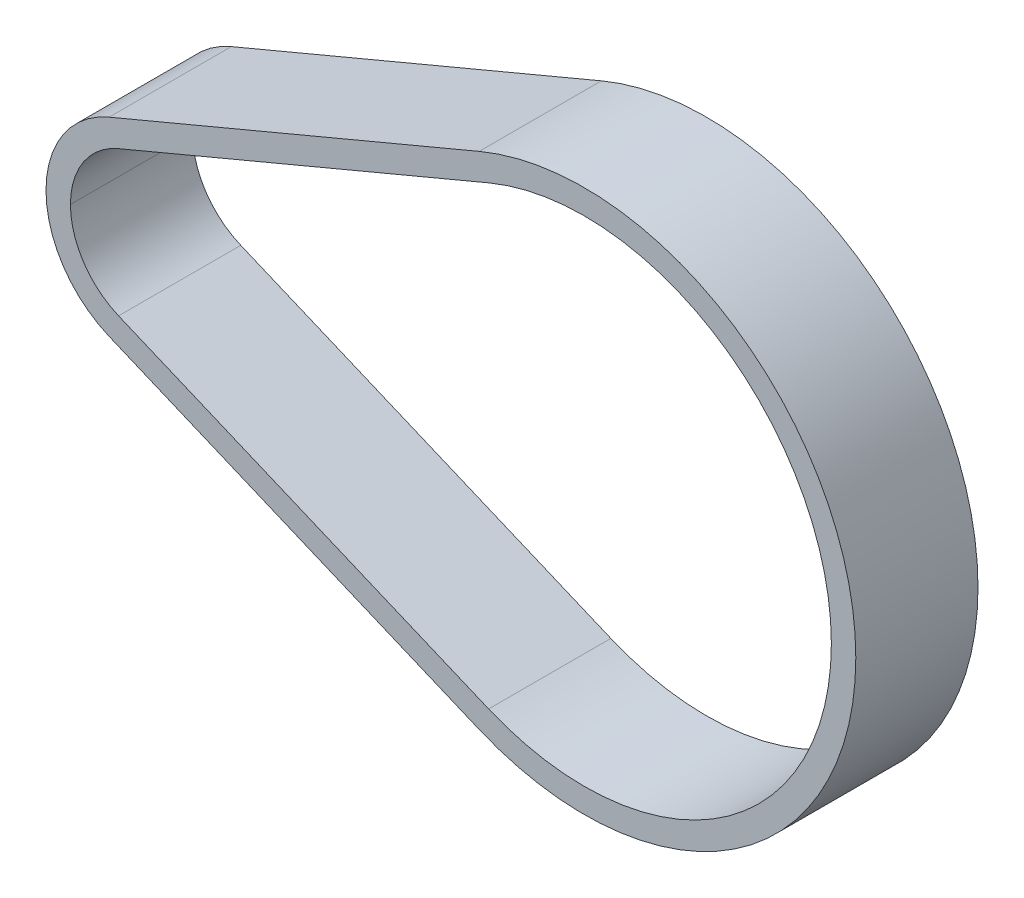
ISO-10303-21;
HEADER;
FILE_DESCRIPTION(('STEP AP214'),'2;1');
FILE_NAME('part.step','',(''),(''),'','','');
FILE_SCHEMA(('AUTOMOTIVE_DESIGN { 1 0 10303 214 1 1 1 1 }'));
ENDSEC;
DATA;
#1=APPLICATION_CONTEXT('core data for automotive mechanical design processes');
#2=APPLICATION_PROTOCOL_DEFINITION('international standard','automotive_design',2000,#1);
#3=PRODUCT_CONTEXT('',#1,'mechanical');
#4=PRODUCT('Part','Part','',(#3));
#5=PRODUCT_RELATED_PRODUCT_CATEGORY('part','',(#4));
#6=PRODUCT_DEFINITION_FORMATION('','',#4);
#7=PRODUCT_DEFINITION_CONTEXT('part definition',#1,'design');
#8=PRODUCT_DEFINITION('design','',#6,#7);
#9=PRODUCT_DEFINITION_SHAPE('','',#8);
#10=(LENGTH_UNIT() NAMED_UNIT(*) SI_UNIT(.MILLI.,.METRE.));
#11=(NAMED_UNIT(*) PLANE_ANGLE_UNIT() SI_UNIT($,.RADIAN.));
#12=(NAMED_UNIT(*) SI_UNIT($,.STERADIAN.) SOLID_ANGLE_UNIT());
#13=UNCERTAINTY_MEASURE_WITH_UNIT(LENGTH_MEASURE(1.E-05),#10,'distance_accuracy_value','');
#14=(GEOMETRIC_REPRESENTATION_CONTEXT(3) GLOBAL_UNCERTAINTY_ASSIGNED_CONTEXT((#13)) GLOBAL_UNIT_ASSIGNED_CONTEXT((#10,
#11,#12)) REPRESENTATION_CONTEXT('',''));
#15=CARTESIAN_POINT('',(0.,0.,0.));
#16=DIRECTION('',(0.,0.,1.));
#17=DIRECTION('',(1.,0.,0.));
#18=AXIS2_PLACEMENT_3D('',#15,#16,#17);
#19=CARTESIAN_POINT('',(0.,0.,15.));
#20=DIRECTION('',(0.,0.,-1.));
#21=DIRECTION('',(-1.,0.,0.));
#22=AXIS2_PLACEMENT_3D('',#19,#20,#21);
#23=CYLINDRICAL_SURFACE('',#22,9.64);
#24=CARTESIAN_POINT('',(0.,0.,15.));
#25=DIRECTION('',(0.,0.,1.));
#26=DIRECTION('',(1.,0.,0.));
#27=AXIS2_PLACEMENT_3D('',#24,#25,#26);
#28=CIRCLE('',#27,9.64);
#29=CARTESIAN_POINT('',(-3.73225299401198,8.88818809368302,15.));
#30=VERTEX_POINT('',#29);
#31=CARTESIAN_POINT('',(-9.64,0.,15.));
#32=VERTEX_POINT('',#31);
#33=EDGE_CURVE('E11',#30,#32,#28,.T.);
#34=ORIENTED_EDGE('',*,*,#33,.T.);
#35=DIRECTION('',(0.,0.,-1.));
#36=VECTOR('',#35,1.);
#37=CARTESIAN_POINT('',(-9.64,0.,15.));
#38=LINE('',#37,#36);
#39=CARTESIAN_POINT('',(-9.64,0.,0.));
#40=VERTEX_POINT('',#39);
#41=EDGE_CURVE('E27',#32,#40,#38,.T.);
#42=ORIENTED_EDGE('',*,*,#41,.T.);
#43=CARTESIAN_POINT('',(0.,0.,0.));
#44=DIRECTION('',(0.,0.,1.));
#45=DIRECTION('',(1.,0.,0.));
#46=AXIS2_PLACEMENT_3D('',#43,#44,#45);
#47=CIRCLE('',#46,9.64);
#48=CARTESIAN_POINT('',(-3.73225299401198,8.88818809368302,0.));
#49=VERTEX_POINT('',#48);
#50=EDGE_CURVE('E179',#49,#40,#47,.T.);
#51=ORIENTED_EDGE('',*,*,#50,.F.);
#52=DIRECTION('',(0.,0.,-1.));
#53=VECTOR('',#52,1.);
#54=CARTESIAN_POINT('',(-3.73225299401198,8.88818809368302,15.));
#55=LINE('',#54,#53);
#56=EDGE_CURVE('E215',#30,#49,#55,.T.);
#57=ORIENTED_EDGE('',*,*,#56,.F.);
#58=EDGE_LOOP('',(#34,#42,#51,#57));
#59=FACE_BOUND('',#58,.T.);
#60=ADVANCED_FACE('F16',(#59),#23,.F.);
#61=CARTESIAN_POINT('',(0.,0.,15.));
#62=DIRECTION('',(0.,0.,-1.));
#63=DIRECTION('',(-1.,0.,0.));
#64=AXIS2_PLACEMENT_3D('',#61,#62,#63);
#65=CYLINDRICAL_SURFACE('',#64,12.64);
#66=CARTESIAN_POINT('',(0.,0.,15.));
#67=DIRECTION('',(0.,0.,1.));
#68=DIRECTION('',(1.,0.,0.));
#69=AXIS2_PLACEMENT_3D('',#66,#67,#68);
#70=CIRCLE('',#69,12.64);
#71=CARTESIAN_POINT('',(-12.64,0.,15.));
#72=VERTEX_POINT('',#71);
#73=CARTESIAN_POINT('',(-4.89374251497006,-11.654221732796,15.));
#74=VERTEX_POINT('',#73);
#75=EDGE_CURVE('E118',#72,#74,#70,.T.);
#76=ORIENTED_EDGE('',*,*,#75,.F.);
#77=DIRECTION('',(0.,0.,-1.));
#78=VECTOR('',#77,1.);
#79=CARTESIAN_POINT('',(-12.64,0.,15.));
#80=LINE('',#79,#78);
#81=CARTESIAN_POINT('',(-12.64,0.,0.));
#82=VERTEX_POINT('',#81);
#83=EDGE_CURVE('E122',#72,#82,#80,.T.);
#84=ORIENTED_EDGE('',*,*,#83,.T.);
#85=CARTESIAN_POINT('',(0.,0.,0.));
#86=DIRECTION('',(0.,0.,1.));
#87=DIRECTION('',(1.,0.,0.));
#88=AXIS2_PLACEMENT_3D('',#85,#86,#87);
#89=CIRCLE('',#88,12.64);
#90=CARTESIAN_POINT('',(-4.89374251497006,-11.654221732796,0.));
#91=VERTEX_POINT('',#90);
#92=EDGE_CURVE('E140',#82,#91,#89,.T.);
#93=ORIENTED_EDGE('',*,*,#92,.T.);
#94=DIRECTION('',(0.,0.,-1.));
#95=VECTOR('',#94,1.);
#96=CARTESIAN_POINT('',(-4.89374251497006,-11.654221732796,15.));
#97=LINE('',#96,#95);
#98=EDGE_CURVE('E124',#74,#91,#97,.T.);
#99=ORIENTED_EDGE('',*,*,#98,.F.);
#100=EDGE_LOOP('',(#76,#84,#93,#99));
#101=FACE_BOUND('',#100,.T.);
#102=ADVANCED_FACE('F120',(#101),#65,.T.);
#103=CARTESIAN_POINT('',(0.,0.,15.));
#104=DIRECTION('',(0.,0.,1.));
#105=DIRECTION('',(1.,0.,0.));
#106=AXIS2_PLACEMENT_3D('',#103,#104,#105);
#107=PLANE('',#106);
#108=CARTESIAN_POINT('',(0.,0.,15.));
#109=DIRECTION('',(0.,0.,1.));
#110=DIRECTION('',(1.,0.,0.));
#111=AXIS2_PLACEMENT_3D('',#108,#109,#110);
#112=CIRCLE('',#111,12.64);
#113=CARTESIAN_POINT('',(-4.89374251497006,11.654221732796,15.));
#114=VERTEX_POINT('',#113);
#115=EDGE_CURVE('E130',#114,#72,#112,.T.);
#116=ORIENTED_EDGE('',*,*,#115,.T.);
#117=ORIENTED_EDGE('',*,*,#75,.T.);
#118=DIRECTION('',(0.922011213037658,-0.387163173652695,0.));
#119=VECTOR('',#118,1.);
#120=CARTESIAN_POINT('',(-4.89374251497006,-11.654221732796,15.));
#121=LINE('',#120,#119);
#122=CARTESIAN_POINT('',(40.5358514221557,-30.7306337305452,15.));
#123=VERTEX_POINT('',#122);
#124=EDGE_CURVE('E20',#74,#123,#121,.T.);
#125=ORIENTED_EDGE('',*,*,#124,.T.);
#126=CARTESIAN_POINT('',(53.44,0.,15.));
#127=DIRECTION('',(0.,0.,1.));
#128=DIRECTION('',(1.,0.,0.));
#129=AXIS2_PLACEMENT_3D('',#126,#127,#128);
#130=CIRCLE('',#129,33.33);
#131=CARTESIAN_POINT('',(40.5358514221557,30.7306337305452,15.));
#132=VERTEX_POINT('',#131);
#133=EDGE_CURVE('E216',#123,#132,#130,.T.);
#134=ORIENTED_EDGE('',*,*,#133,.T.);
#135=DIRECTION('',(-0.922011213037658,-0.387163173652695,0.));
#136=VECTOR('',#135,1.);
#137=CARTESIAN_POINT('',(-4.89374251497006,11.654221732796,15.));
#138=LINE('',#137,#136);
#139=EDGE_CURVE('E144',#132,#114,#138,.T.);
#140=ORIENTED_EDGE('',*,*,#139,.T.);
#141=EDGE_LOOP('',(#116,#117,#125,#134,#140));
#142=FACE_BOUND('',#141,.T.);
#143=DIRECTION('',(0.922011213037658,-0.387163173652695,0.));
#144=VECTOR('',#143,1.);
#145=CARTESIAN_POINT('',(-3.73225299401198,-8.88818809368302,15.));
#146=LINE('',#145,#144);
#147=CARTESIAN_POINT('',(-3.73225299401198,-8.88818809368302,15.));
#148=VERTEX_POINT('',#147);
#149=CARTESIAN_POINT('',(41.6973409431137,-27.9646000914321,15.));
#150=VERTEX_POINT('',#149);
#151=EDGE_CURVE('E161',#148,#150,#146,.T.);
#152=ORIENTED_EDGE('',*,*,#151,.F.);
#153=CARTESIAN_POINT('',(0.,0.,15.));
#154=DIRECTION('',(0.,0.,1.));
#155=DIRECTION('',(1.,0.,0.));
#156=AXIS2_PLACEMENT_3D('',#153,#154,#155);
#157=CIRCLE('',#156,9.64);
#158=EDGE_CURVE('E198',#32,#148,#157,.T.);
#159=ORIENTED_EDGE('',*,*,#158,.F.);
#160=ORIENTED_EDGE('',*,*,#33,.F.);
#161=DIRECTION('',(-0.922011213037658,-0.387163173652695,0.));
#162=VECTOR('',#161,1.);
#163=CARTESIAN_POINT('',(-3.73225299401198,8.88818809368302,15.));
#164=LINE('',#163,#162);
#165=CARTESIAN_POINT('',(41.6973409431138,27.9646000914321,15.));
#166=VERTEX_POINT('',#165);
#167=EDGE_CURVE('E210',#166,#30,#164,.T.);
#168=ORIENTED_EDGE('',*,*,#167,.F.);
#169=CARTESIAN_POINT('',(53.44,0.,15.));
#170=DIRECTION('',(0.,0.,1.));
#171=DIRECTION('',(1.,0.,0.));
#172=AXIS2_PLACEMENT_3D('',#169,#170,#171);
#173=CIRCLE('',#172,30.33);
#174=EDGE_CURVE('E197',#150,#166,#173,.T.);
#175=ORIENTED_EDGE('',*,*,#174,.F.);
#176=EDGE_LOOP('',(#152,#159,#160,#168,#175));
#177=FACE_BOUND('',#176,.T.);
#178=ADVANCED_FACE('F141',(#142,#177),#107,.T.);
#179=CARTESIAN_POINT('',(0.,0.,0.));
#180=DIRECTION('',(0.,0.,1.));
#181=DIRECTION('',(1.,0.,0.));
#182=AXIS2_PLACEMENT_3D('',#179,#180,#181);
#183=PLANE('',#182);
#184=CARTESIAN_POINT('',(0.,0.,0.));
#185=DIRECTION('',(0.,0.,1.));
#186=DIRECTION('',(1.,0.,0.));
#187=AXIS2_PLACEMENT_3D('',#184,#185,#186);
#188=CIRCLE('',#187,12.64);
#189=CARTESIAN_POINT('',(-4.89374251497006,11.654221732796,0.));
#190=VERTEX_POINT('',#189);
#191=EDGE_CURVE('E138',#190,#82,#188,.T.);
#192=ORIENTED_EDGE('',*,*,#191,.F.);
#193=DIRECTION('',(-0.922011213037658,-0.387163173652695,0.));
#194=VECTOR('',#193,1.);
#195=CARTESIAN_POINT('',(-4.89374251497006,11.654221732796,0.));
#196=LINE('',#195,#194);
#197=CARTESIAN_POINT('',(40.5358514221557,30.7306337305452,0.));
#198=VERTEX_POINT('',#197);
#199=EDGE_CURVE('E160',#198,#190,#196,.T.);
#200=ORIENTED_EDGE('',*,*,#199,.F.);
#201=CARTESIAN_POINT('',(53.44,0.,0.));
#202=DIRECTION('',(0.,0.,1.));
#203=DIRECTION('',(1.,0.,0.));
#204=AXIS2_PLACEMENT_3D('',#201,#202,#203);
#205=CIRCLE('',#204,33.33);
#206=CARTESIAN_POINT('',(40.5358514221557,-30.7306337305452,0.));
#207=VERTEX_POINT('',#206);
#208=EDGE_CURVE('E159',#207,#198,#205,.T.);
#209=ORIENTED_EDGE('',*,*,#208,.F.);
#210=DIRECTION('',(0.922011213037658,-0.387163173652695,0.));
#211=VECTOR('',#210,1.);
#212=CARTESIAN_POINT('',(-4.89374251497006,-11.654221732796,0.));
#213=LINE('',#212,#211);
#214=EDGE_CURVE('E202',#91,#207,#213,.T.);
#215=ORIENTED_EDGE('',*,*,#214,.F.);
#216=ORIENTED_EDGE('',*,*,#92,.F.);
#217=EDGE_LOOP('',(#192,#200,#209,#215,#216));
#218=FACE_BOUND('',#217,.T.);
#219=ORIENTED_EDGE('',*,*,#50,.T.);
#220=CARTESIAN_POINT('',(0.,0.,0.));
#221=DIRECTION('',(0.,0.,1.));
#222=DIRECTION('',(1.,0.,0.));
#223=AXIS2_PLACEMENT_3D('',#220,#221,#222);
#224=CIRCLE('',#223,9.64);
#225=CARTESIAN_POINT('',(-3.73225299401198,-8.88818809368302,0.));
#226=VERTEX_POINT('',#225);
#227=EDGE_CURVE('E170',#40,#226,#224,.T.);
#228=ORIENTED_EDGE('',*,*,#227,.T.);
#229=DIRECTION('',(0.922011213037658,-0.387163173652695,0.));
#230=VECTOR('',#229,1.);
#231=CARTESIAN_POINT('',(-3.73225299401198,-8.88818809368302,0.));
#232=LINE('',#231,#230);
#233=CARTESIAN_POINT('',(41.6973409431137,-27.9646000914321,0.));
#234=VERTEX_POINT('',#233);
#235=EDGE_CURVE('E167',#226,#234,#232,.T.);
#236=ORIENTED_EDGE('',*,*,#235,.T.);
#237=CARTESIAN_POINT('',(53.44,0.,0.));
#238=DIRECTION('',(0.,0.,1.));
#239=DIRECTION('',(1.,0.,0.));
#240=AXIS2_PLACEMENT_3D('',#237,#238,#239);
#241=CIRCLE('',#240,30.33);
#242=CARTESIAN_POINT('',(41.6973409431137,27.9646000914321,0.));
#243=VERTEX_POINT('',#242);
#244=EDGE_CURVE('E171',#234,#243,#241,.T.);
#245=ORIENTED_EDGE('',*,*,#244,.T.);
#246=DIRECTION('',(-0.922011213037658,-0.387163173652695,0.));
#247=VECTOR('',#246,1.);
#248=CARTESIAN_POINT('',(-3.73225299401198,8.88818809368302,0.));
#249=LINE('',#248,#247);
#250=EDGE_CURVE('E182',#243,#49,#249,.T.);
#251=ORIENTED_EDGE('',*,*,#250,.T.);
#252=EDGE_LOOP('',(#219,#228,#236,#245,#251));
#253=FACE_BOUND('',#252,.T.);
#254=ADVANCED_FACE('F229',(#218,#253),#183,.F.);
#255=CARTESIAN_POINT('',(0.,0.,15.));
#256=DIRECTION('',(0.,0.,-1.));
#257=DIRECTION('',(-1.,0.,0.));
#258=AXIS2_PLACEMENT_3D('',#255,#256,#257);
#259=CYLINDRICAL_SURFACE('',#258,12.64);
#260=ORIENTED_EDGE('',*,*,#83,.F.);
#261=ORIENTED_EDGE('',*,*,#115,.F.);
#262=DIRECTION('',(0.,0.,-1.));
#263=VECTOR('',#262,1.);
#264=CARTESIAN_POINT('',(-4.89374251497006,11.654221732796,15.));
#265=LINE('',#264,#263);
#266=EDGE_CURVE('E190',#114,#190,#265,.T.);
#267=ORIENTED_EDGE('',*,*,#266,.T.);
#268=ORIENTED_EDGE('',*,*,#191,.T.);
#269=EDGE_LOOP('',(#260,#261,#267,#268));
#270=FACE_BOUND('',#269,.T.);
#271=ADVANCED_FACE('F134',(#270),#259,.T.);
#272=CARTESIAN_POINT('',(-4.89374251497006,-11.654221732796,15.));
#273=DIRECTION('',(0.387163173652695,0.922011213037658,0.));
#274=DIRECTION('',(0.,0.,-1.));
#275=AXIS2_PLACEMENT_3D('',#272,#273,#274);
#276=PLANE('',#275);
#277=ORIENTED_EDGE('',*,*,#214,.T.);
#278=DIRECTION('',(0.,0.,-1.));
#279=VECTOR('',#278,1.);
#280=CARTESIAN_POINT('',(40.5358514221557,-30.7306337305452,15.));
#281=LINE('',#280,#279);
#282=EDGE_CURVE('E156',#123,#207,#281,.T.);
#283=ORIENTED_EDGE('',*,*,#282,.F.);
#284=ORIENTED_EDGE('',*,*,#124,.F.);
#285=ORIENTED_EDGE('',*,*,#98,.T.);
#286=EDGE_LOOP('',(#277,#283,#284,#285));
#287=FACE_BOUND('',#286,.T.);
#288=ADVANCED_FACE('F269',(#287),#276,.F.);
#289=CARTESIAN_POINT('',(53.44,0.,15.));
#290=DIRECTION('',(0.,0.,-1.));
#291=DIRECTION('',(-1.,0.,0.));
#292=AXIS2_PLACEMENT_3D('',#289,#290,#291);
#293=CYLINDRICAL_SURFACE('',#292,33.33);
#294=ORIENTED_EDGE('',*,*,#208,.T.);
#295=DIRECTION('',(0.,0.,-1.));
#296=VECTOR('',#295,1.);
#297=CARTESIAN_POINT('',(40.5358514221557,30.7306337305452,15.));
#298=LINE('',#297,#296);
#299=EDGE_CURVE('E201',#132,#198,#298,.T.);
#300=ORIENTED_EDGE('',*,*,#299,.F.);
#301=ORIENTED_EDGE('',*,*,#133,.F.);
#302=ORIENTED_EDGE('',*,*,#282,.T.);
#303=EDGE_LOOP('',(#294,#300,#301,#302));
#304=FACE_BOUND('',#303,.T.);
#305=ADVANCED_FACE('F288',(#304),#293,.T.);
#306=CARTESIAN_POINT('',(-4.89374251497006,11.654221732796,15.));
#307=DIRECTION('',(0.387163173652695,-0.922011213037658,0.));
#308=DIRECTION('',(0.,0.,-1.));
#309=AXIS2_PLACEMENT_3D('',#306,#307,#308);
#310=PLANE('',#309);
#311=ORIENTED_EDGE('',*,*,#199,.T.);
#312=ORIENTED_EDGE('',*,*,#266,.F.);
#313=ORIENTED_EDGE('',*,*,#139,.F.);
#314=ORIENTED_EDGE('',*,*,#299,.T.);
#315=EDGE_LOOP('',(#311,#312,#313,#314));
#316=FACE_BOUND('',#315,.T.);
#317=ADVANCED_FACE('F225',(#316),#310,.F.);
#318=CARTESIAN_POINT('',(0.,0.,15.));
#319=DIRECTION('',(0.,0.,-1.));
#320=DIRECTION('',(-1.,0.,0.));
#321=AXIS2_PLACEMENT_3D('',#318,#319,#320);
#322=CYLINDRICAL_SURFACE('',#321,9.64);
#323=ORIENTED_EDGE('',*,*,#41,.F.);
#324=ORIENTED_EDGE('',*,*,#158,.T.);
#325=DIRECTION('',(0.,0.,-1.));
#326=VECTOR('',#325,1.);
#327=CARTESIAN_POINT('',(-3.73225299401198,-8.88818809368302,15.));
#328=LINE('',#327,#326);
#329=EDGE_CURVE('E165',#148,#226,#328,.T.);
#330=ORIENTED_EDGE('',*,*,#329,.T.);
#331=ORIENTED_EDGE('',*,*,#227,.F.);
#332=EDGE_LOOP('',(#323,#324,#330,#331));
#333=FACE_BOUND('',#332,.T.);
#334=ADVANCED_FACE('F283',(#333),#322,.F.);
#335=CARTESIAN_POINT('',(-3.73225299401198,-8.88818809368302,15.));
#336=DIRECTION('',(0.387163173652695,0.922011213037658,0.));
#337=DIRECTION('',(0.,0.,-1.));
#338=AXIS2_PLACEMENT_3D('',#335,#336,#337);
#339=PLANE('',#338);
#340=ORIENTED_EDGE('',*,*,#235,.F.);
#341=ORIENTED_EDGE('',*,*,#329,.F.);
#342=ORIENTED_EDGE('',*,*,#151,.T.);
#343=DIRECTION('',(0.,0.,-1.));
#344=VECTOR('',#343,1.);
#345=CARTESIAN_POINT('',(41.6973409431137,-27.9646000914321,15.));
#346=LINE('',#345,#344);
#347=EDGE_CURVE('E166',#150,#234,#346,.T.);
#348=ORIENTED_EDGE('',*,*,#347,.T.);
#349=EDGE_LOOP('',(#340,#341,#342,#348));
#350=FACE_BOUND('',#349,.T.);
#351=ADVANCED_FACE('F18',(#350),#339,.T.);
#352=CARTESIAN_POINT('',(53.44,0.,15.));
#353=DIRECTION('',(0.,0.,-1.));
#354=DIRECTION('',(-1.,0.,0.));
#355=AXIS2_PLACEMENT_3D('',#352,#353,#354);
#356=CYLINDRICAL_SURFACE('',#355,30.33);
#357=ORIENTED_EDGE('',*,*,#244,.F.);
#358=ORIENTED_EDGE('',*,*,#347,.F.);
#359=ORIENTED_EDGE('',*,*,#174,.T.);
#360=DIRECTION('',(0.,0.,-1.));
#361=VECTOR('',#360,1.);
#362=CARTESIAN_POINT('',(41.6973409431137,27.9646000914321,15.));
#363=LINE('',#362,#361);
#364=EDGE_CURVE('E214',#166,#243,#363,.T.);
#365=ORIENTED_EDGE('',*,*,#364,.T.);
#366=EDGE_LOOP('',(#357,#358,#359,#365));
#367=FACE_BOUND('',#366,.T.);
#368=ADVANCED_FACE('F280',(#367),#356,.F.);
#369=CARTESIAN_POINT('',(-3.73225299401198,8.88818809368302,15.));
#370=DIRECTION('',(0.387163173652695,-0.922011213037658,0.));
#371=DIRECTION('',(0.,0.,-1.));
#372=AXIS2_PLACEMENT_3D('',#369,#370,#371);
#373=PLANE('',#372);
#374=ORIENTED_EDGE('',*,*,#250,.F.);
#375=ORIENTED_EDGE('',*,*,#364,.F.);
#376=ORIENTED_EDGE('',*,*,#167,.T.);
#377=ORIENTED_EDGE('',*,*,#56,.T.);
#378=EDGE_LOOP('',(#374,#375,#376,#377));
#379=FACE_BOUND('',#378,.T.);
#380=ADVANCED_FACE('F259',(#379),#373,.T.);
#381=CLOSED_SHELL('',(#60,#102,#178,#254,#271,#288,#305,#317,#334,#351,#368,#380));
#382=MANIFOLD_SOLID_BREP('B1',#381);
#383=ADVANCED_BREP_SHAPE_REPRESENTATION('',(#18,#382),#14);
#384=SHAPE_DEFINITION_REPRESENTATION(#9,#383);
ENDSEC;
END-ISO-10303-21;
